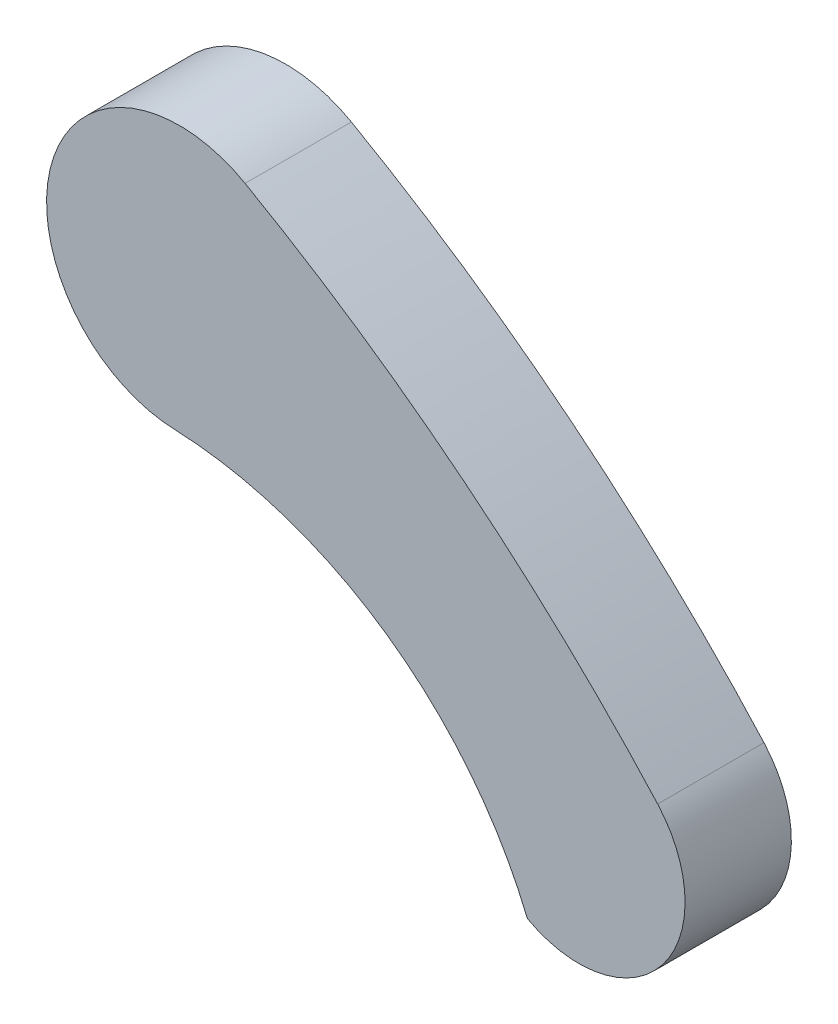
ISO-10303-21;
HEADER;
FILE_DESCRIPTION(('STEP AP214'),'2;1');
FILE_NAME('part.step','',(''),(''),'','','');
FILE_SCHEMA(('AUTOMOTIVE_DESIGN { 1 0 10303 214 1 1 1 1 }'));
ENDSEC;
DATA;
#1=APPLICATION_CONTEXT('core data for automotive mechanical design processes');
#2=APPLICATION_PROTOCOL_DEFINITION('international standard','automotive_design',2000,#1);
#3=PRODUCT_CONTEXT('',#1,'mechanical');
#4=PRODUCT('Part','Part','',(#3));
#5=PRODUCT_RELATED_PRODUCT_CATEGORY('part','',(#4));
#6=PRODUCT_DEFINITION_FORMATION('','',#4);
#7=PRODUCT_DEFINITION_CONTEXT('part definition',#1,'design');
#8=PRODUCT_DEFINITION('design','',#6,#7);
#9=PRODUCT_DEFINITION_SHAPE('','',#8);
#10=(LENGTH_UNIT() NAMED_UNIT(*) SI_UNIT(.MILLI.,.METRE.));
#11=(NAMED_UNIT(*) PLANE_ANGLE_UNIT() SI_UNIT($,.RADIAN.));
#12=(NAMED_UNIT(*) SI_UNIT($,.STERADIAN.) SOLID_ANGLE_UNIT());
#13=UNCERTAINTY_MEASURE_WITH_UNIT(LENGTH_MEASURE(1.E-05),#10,'distance_accuracy_value','');
#14=(GEOMETRIC_REPRESENTATION_CONTEXT(3) GLOBAL_UNCERTAINTY_ASSIGNED_CONTEXT((#13)) GLOBAL_UNIT_ASSIGNED_CONTEXT((#10,
#11,#12)) REPRESENTATION_CONTEXT('',''));
#15=CARTESIAN_POINT('',(0.,0.,0.));
#16=DIRECTION('',(0.,0.,1.));
#17=DIRECTION('',(1.,0.,0.));
#18=AXIS2_PLACEMENT_3D('',#15,#16,#17);
#19=CARTESIAN_POINT('',(-32.3987270896422,68.4640232747903,185.));
#20=DIRECTION('',(0.,0.,1.));
#21=DIRECTION('',(-0.0395334001462223,-0.999218249569572,0.));
#22=AXIS2_PLACEMENT_3D('',#19,#20,#21);
#23=CYLINDRICAL_SURFACE('',#22,20.0000000000121);
#24=CARTESIAN_POINT('',(-32.3987270896422,68.4640232747903,201.));
#25=DIRECTION('',(0.,0.,1.));
#26=DIRECTION('',(-0.292371704722668,-0.956304755963056,0.));
#27=AXIS2_PLACEMENT_3D('',#24,#25,#26);
#28=CIRCLE('',#27,20.0000000000121);
#29=CARTESIAN_POINT('',(-22.5214212115166,85.8547917624207,201.));
#30=VERTEX_POINT('',#29);
#31=CARTESIAN_POINT('',(-33.1893950925671,48.4796582833885,201.));
#32=VERTEX_POINT('',#31);
#33=EDGE_CURVE('E106',#30,#32,#28,.T.);
#34=ORIENTED_EDGE('',*,*,#33,.F.);
#35=DIRECTION('',(0.,0.,1.));
#36=VECTOR('',#35,1.);
#37=CARTESIAN_POINT('',(-22.5214212115166,85.8547917624207,185.));
#38=LINE('',#37,#36);
#39=CARTESIAN_POINT('',(-22.5214212115166,85.8547917624207,185.));
#40=VERTEX_POINT('',#39);
#41=EDGE_CURVE('E39',#40,#30,#38,.T.);
#42=ORIENTED_EDGE('',*,*,#41,.F.);
#43=CARTESIAN_POINT('',(-32.3987270896422,68.4640232747903,185.));
#44=DIRECTION('',(0.,0.,1.));
#45=DIRECTION('',(-0.292371704722668,-0.956304755963056,0.));
#46=AXIS2_PLACEMENT_3D('',#43,#44,#45);
#47=CIRCLE('',#46,20.0000000000121);
#48=CARTESIAN_POINT('',(-33.1893950925671,48.4796582833885,185.));
#49=VERTEX_POINT('',#48);
#50=EDGE_CURVE('E90',#40,#49,#47,.T.);
#51=ORIENTED_EDGE('',*,*,#50,.T.);
#52=DIRECTION('',(0.,0.,1.));
#53=VECTOR('',#52,1.);
#54=CARTESIAN_POINT('',(-33.1893950925671,48.4796582833885,185.));
#55=LINE('',#54,#53);
#56=EDGE_CURVE('E11',#49,#32,#55,.T.);
#57=ORIENTED_EDGE('',*,*,#56,.T.);
#58=EDGE_LOOP('',(#34,#42,#51,#57));
#59=FACE_BOUND('',#58,.T.);
#60=ADVANCED_FACE('F18',(#59),#23,.T.);
#61=CARTESIAN_POINT('',(-35.5613991013399,-11.4734366907705,185.));
#62=DIRECTION('',(0.,0.,1.));
#63=DIRECTION('',(-0.0395334001462223,-0.999218249569572,0.));
#64=AXIS2_PLACEMENT_3D('',#61,#62,#63);
#65=CYLINDRICAL_SURFACE('',#64,59.9999999999847);
#66=CARTESIAN_POINT('',(-35.5613991013399,-11.4734366907705,201.));
#67=DIRECTION('',(0.,0.,-1.));
#68=DIRECTION('',(-0.292371704722669,-0.956304755963056,0.));
#69=AXIS2_PLACEMENT_3D('',#66,#67,#68);
#70=CIRCLE('',#69,59.9999999999847);
#71=CARTESIAN_POINT('',(19.9577454978604,11.277927729221,201.));
#72=VERTEX_POINT('',#71);
#73=EDGE_CURVE('E103',#32,#72,#70,.T.);
#74=ORIENTED_EDGE('',*,*,#73,.F.);
#75=ORIENTED_EDGE('',*,*,#56,.F.);
#76=CARTESIAN_POINT('',(-35.5613991013399,-11.4734366907705,185.));
#77=DIRECTION('',(0.,0.,-1.));
#78=DIRECTION('',(-0.292371704722669,-0.956304755963056,0.));
#79=AXIS2_PLACEMENT_3D('',#76,#77,#78);
#80=CIRCLE('',#79,59.9999999999847);
#81=CARTESIAN_POINT('',(19.9577454978604,11.277927729221,185.));
#82=VERTEX_POINT('',#81);
#83=EDGE_CURVE('E85',#49,#82,#80,.T.);
#84=ORIENTED_EDGE('',*,*,#83,.T.);
#85=DIRECTION('',(0.,0.,1.));
#86=VECTOR('',#85,1.);
#87=CARTESIAN_POINT('',(19.9577454978604,11.277927729221,185.));
#88=LINE('',#87,#86);
#89=EDGE_CURVE('E27',#82,#72,#88,.T.);
#90=ORIENTED_EDGE('',*,*,#89,.T.);
#91=EDGE_LOOP('',(#74,#75,#84,#90));
#92=FACE_BOUND('',#91,.T.);
#93=ADVANCED_FACE('F86',(#92),#65,.F.);
#94=CARTESIAN_POINT('',(27.6957214208313,25.2823459112114,185.));
#95=DIRECTION('',(0.,0.,1.));
#96=DIRECTION('',(-0.0395334001462223,-0.999218249569572,0.));
#97=AXIS2_PLACEMENT_3D('',#94,#95,#96);
#98=CYLINDRICAL_SURFACE('',#97,16.0000000000047);
#99=CARTESIAN_POINT('',(27.6957214208313,25.2823459112114,201.));
#100=DIRECTION('',(0.,0.,1.));
#101=DIRECTION('',(-0.292371704722669,-0.956304755963056,0.));
#102=AXIS2_PLACEMENT_3D('',#99,#100,#101);
#103=CIRCLE('',#102,16.0000000000047);
#104=CARTESIAN_POINT('',(39.5715139752873,36.0045449022614,201.));
#105=VERTEX_POINT('',#104);
#106=EDGE_CURVE('E82',#72,#105,#103,.T.);
#107=ORIENTED_EDGE('',*,*,#106,.F.);
#108=ORIENTED_EDGE('',*,*,#89,.F.);
#109=CARTESIAN_POINT('',(27.6957214208313,25.2823459112114,185.));
#110=DIRECTION('',(0.,0.,1.));
#111=DIRECTION('',(-0.292371704722669,-0.956304755963056,0.));
#112=AXIS2_PLACEMENT_3D('',#109,#110,#111);
#113=CIRCLE('',#112,16.0000000000047);
#114=CARTESIAN_POINT('',(39.5715139752873,36.0045449022614,185.));
#115=VERTEX_POINT('',#114);
#116=EDGE_CURVE('E79',#82,#115,#113,.T.);
#117=ORIENTED_EDGE('',*,*,#116,.T.);
#118=DIRECTION('',(0.,0.,1.));
#119=VECTOR('',#118,1.);
#120=CARTESIAN_POINT('',(39.5715139752873,36.0045449022614,185.));
#121=LINE('',#120,#119);
#122=EDGE_CURVE('E60',#115,#105,#121,.T.);
#123=ORIENTED_EDGE('',*,*,#122,.T.);
#124=EDGE_LOOP('',(#107,#108,#117,#123));
#125=FACE_BOUND('',#124,.T.);
#126=ADVANCED_FACE('F77',(#125),#98,.T.);
#127=CARTESIAN_POINT('',(-145.987744688004,-131.529814332818,185.));
#128=DIRECTION('',(0.,0.,1.));
#129=DIRECTION('',(-0.0395334001462223,-0.999218249569572,0.));
#130=AXIS2_PLACEMENT_3D('',#127,#128,#129);
#131=CYLINDRICAL_SURFACE('',#130,249.999999999965);
#132=CARTESIAN_POINT('',(-145.987744688004,-131.529814332818,201.));
#133=DIRECTION('',(0.,0.,1.));
#134=DIRECTION('',(-0.292371704722669,-0.956304755963056,0.));
#135=AXIS2_PLACEMENT_3D('',#132,#133,#134);
#136=CIRCLE('',#135,249.999999999965);
#137=EDGE_CURVE('E102',#105,#30,#136,.T.);
#138=ORIENTED_EDGE('',*,*,#137,.F.);
#139=ORIENTED_EDGE('',*,*,#122,.F.);
#140=CARTESIAN_POINT('',(-145.987744688004,-131.529814332818,185.));
#141=DIRECTION('',(0.,0.,1.));
#142=DIRECTION('',(-0.292371704722669,-0.956304755963056,0.));
#143=AXIS2_PLACEMENT_3D('',#140,#141,#142);
#144=CIRCLE('',#143,249.999999999965);
#145=EDGE_CURVE('E93',#115,#40,#144,.T.);
#146=ORIENTED_EDGE('',*,*,#145,.T.);
#147=ORIENTED_EDGE('',*,*,#41,.T.);
#148=EDGE_LOOP('',(#138,#139,#146,#147));
#149=FACE_BOUND('',#148,.T.);
#150=ADVANCED_FACE('F140',(#149),#131,.T.);
#151=CARTESIAN_POINT('',(-33.980063095491,28.4952932920099,185.));
#152=DIRECTION('',(0.,0.,1.));
#153=DIRECTION('',(0.999218249569572,-0.0395334001462223,0.));
#154=AXIS2_PLACEMENT_3D('',#151,#152,#153);
#155=PLANE('',#154);
#156=ORIENTED_EDGE('',*,*,#50,.F.);
#157=ORIENTED_EDGE('',*,*,#145,.F.);
#158=ORIENTED_EDGE('',*,*,#116,.F.);
#159=ORIENTED_EDGE('',*,*,#83,.F.);
#160=EDGE_LOOP('',(#156,#157,#158,#159));
#161=FACE_BOUND('',#160,.T.);
#162=ADVANCED_FACE('F92',(#161),#155,.F.);
#163=CARTESIAN_POINT('',(-33.980063095491,28.4952932920099,201.));
#164=DIRECTION('',(0.,0.,1.));
#165=DIRECTION('',(0.999218249569572,-0.0395334001462223,0.));
#166=AXIS2_PLACEMENT_3D('',#163,#164,#165);
#167=PLANE('',#166);
#168=ORIENTED_EDGE('',*,*,#33,.T.);
#169=ORIENTED_EDGE('',*,*,#73,.T.);
#170=ORIENTED_EDGE('',*,*,#106,.T.);
#171=ORIENTED_EDGE('',*,*,#137,.T.);
#172=EDGE_LOOP('',(#168,#169,#170,#171));
#173=FACE_BOUND('',#172,.T.);
#174=ADVANCED_FACE('F124',(#173),#167,.T.);
#175=CLOSED_SHELL('',(#60,#93,#126,#150,#162,#174));
#176=MANIFOLD_SOLID_BREP('B1',#175);
#177=ADVANCED_BREP_SHAPE_REPRESENTATION('',(#18,#176),#14);
#178=SHAPE_DEFINITION_REPRESENTATION(#9,#177);
ENDSEC;
END-ISO-10303-21;
